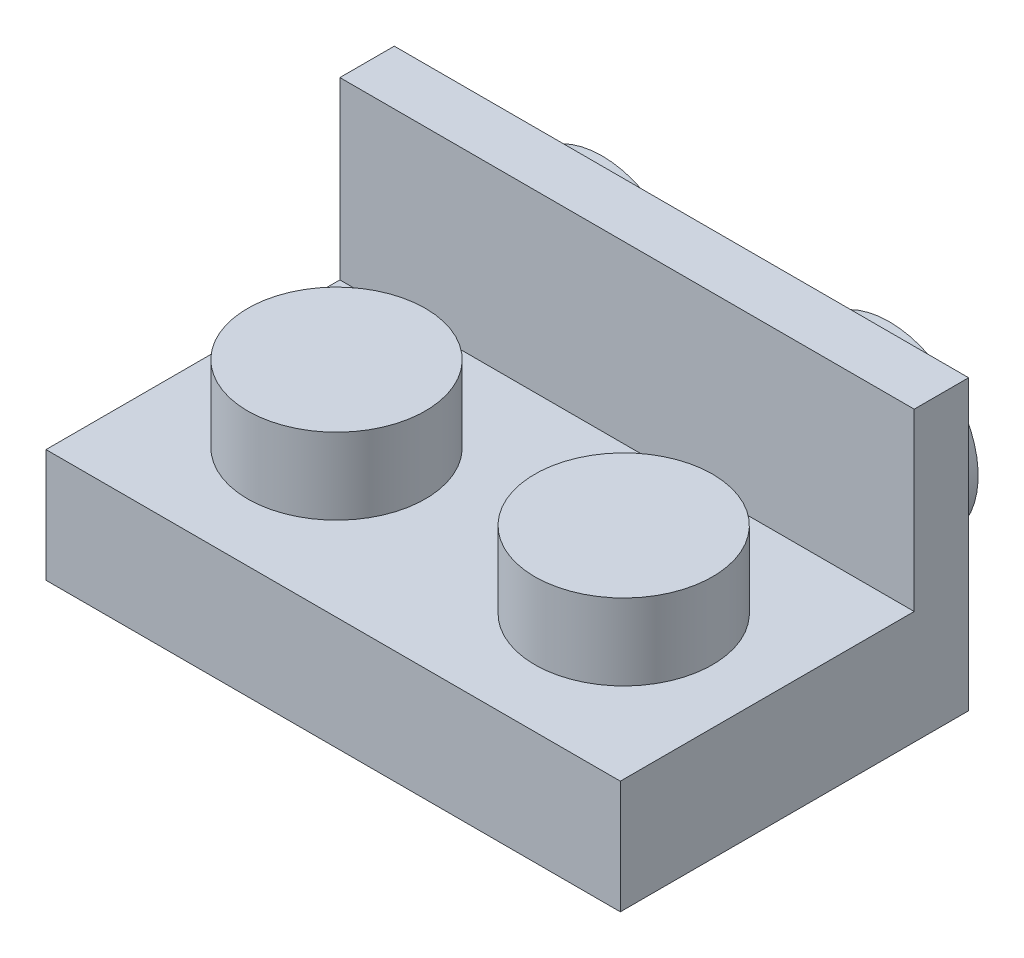
ISO-10303-21;
HEADER;
FILE_DESCRIPTION(('STEP AP214'),'2;1');
FILE_NAME('part.step','',(''),(''),'','','');
FILE_SCHEMA(('AUTOMOTIVE_DESIGN { 1 0 10303 214 1 1 1 1 }'));
ENDSEC;
DATA;
#1=APPLICATION_CONTEXT('core data for automotive mechanical design processes');
#2=APPLICATION_PROTOCOL_DEFINITION('international standard','automotive_design',2000,#1);
#3=PRODUCT_CONTEXT('',#1,'mechanical');
#4=PRODUCT('Part','Part','',(#3));
#5=PRODUCT_RELATED_PRODUCT_CATEGORY('part','',(#4));
#6=PRODUCT_DEFINITION_FORMATION('','',#4);
#7=PRODUCT_DEFINITION_CONTEXT('part definition',#1,'design');
#8=PRODUCT_DEFINITION('design','',#6,#7);
#9=PRODUCT_DEFINITION_SHAPE('','',#8);
#10=(LENGTH_UNIT() NAMED_UNIT(*) SI_UNIT(.MILLI.,.METRE.));
#11=(NAMED_UNIT(*) PLANE_ANGLE_UNIT() SI_UNIT($,.RADIAN.));
#12=(NAMED_UNIT(*) SI_UNIT($,.STERADIAN.) SOLID_ANGLE_UNIT());
#13=UNCERTAINTY_MEASURE_WITH_UNIT(LENGTH_MEASURE(1.E-05),#10,'distance_accuracy_value','');
#14=(GEOMETRIC_REPRESENTATION_CONTEXT(3) GLOBAL_UNCERTAINTY_ASSIGNED_CONTEXT((#13)) GLOBAL_UNIT_ASSIGNED_CONTEXT((#10,
#11,#12)) REPRESENTATION_CONTEXT('',''));
#15=CARTESIAN_POINT('',(0.,0.,0.));
#16=DIRECTION('',(0.,0.,1.));
#17=DIRECTION('',(1.,0.,0.));
#18=AXIS2_PLACEMENT_3D('',#15,#16,#17);
#19=CARTESIAN_POINT('',(-15.83,-3.12,-1.5));
#20=DIRECTION('',(0.,-1.,0.));
#21=DIRECTION('',(0.,0.,-1.));
#22=AXIS2_PLACEMENT_3D('',#19,#20,#21);
#23=PLANE('',#22);
#24=DIRECTION('',(0.,0.,-1.));
#25=VECTOR('',#24,1.);
#26=CARTESIAN_POINT('',(0.,-3.12,-1.5));
#27=LINE('',#26,#25);
#28=CARTESIAN_POINT('',(0.,-3.12,8.1));
#29=VERTEX_POINT('',#28);
#30=CARTESIAN_POINT('',(0.,-3.12,-1.5));
#31=VERTEX_POINT('',#30);
#32=EDGE_CURVE('E142',#29,#31,#27,.T.);
#33=ORIENTED_EDGE('',*,*,#32,.F.);
#34=DIRECTION('',(1.,0.,0.));
#35=VECTOR('',#34,1.);
#36=CARTESIAN_POINT('',(-15.83,-3.12,8.1));
#37=LINE('',#36,#35);
#38=CARTESIAN_POINT('',(-15.83,-3.12,8.1));
#39=VERTEX_POINT('',#38);
#40=EDGE_CURVE('E156',#39,#29,#37,.T.);
#41=ORIENTED_EDGE('',*,*,#40,.F.);
#42=DIRECTION('',(0.,0.,-1.));
#43=VECTOR('',#42,1.);
#44=CARTESIAN_POINT('',(-15.83,-3.12,-1.5));
#45=LINE('',#44,#43);
#46=CARTESIAN_POINT('',(-15.83,-3.12,-1.5));
#47=VERTEX_POINT('',#46);
#48=EDGE_CURVE('E128',#39,#47,#45,.T.);
#49=ORIENTED_EDGE('',*,*,#48,.T.);
#50=DIRECTION('',(1.,0.,0.));
#51=VECTOR('',#50,1.);
#52=CARTESIAN_POINT('',(-15.83,-3.12,-1.5));
#53=LINE('',#52,#51);
#54=EDGE_CURVE('E117',#47,#31,#53,.T.);
#55=ORIENTED_EDGE('',*,*,#54,.T.);
#56=EDGE_LOOP('',(#33,#41,#49,#55));
#57=FACE_BOUND('',#56,.T.);
#58=DIRECTION('',(1.,0.,0.));
#59=VECTOR('',#58,1.);
#60=CARTESIAN_POINT('',(-15.83,-3.12,6.6));
#61=LINE('',#60,#59);
#62=CARTESIAN_POINT('',(-14.33,-3.12,6.6));
#63=VERTEX_POINT('',#62);
#64=CARTESIAN_POINT('',(-1.5,-3.12,6.6));
#65=VERTEX_POINT('',#64);
#66=EDGE_CURVE('E226',#63,#65,#61,.T.);
#67=ORIENTED_EDGE('',*,*,#66,.T.);
#68=DIRECTION('',(0.,0.,-1.));
#69=VECTOR('',#68,1.);
#70=CARTESIAN_POINT('',(-1.5,-3.12,0.));
#71=LINE('',#70,#69);
#72=CARTESIAN_POINT('',(-1.5,-3.12,0.));
#73=VERTEX_POINT('',#72);
#74=EDGE_CURVE('E230',#65,#73,#71,.T.);
#75=ORIENTED_EDGE('',*,*,#74,.T.);
#76=DIRECTION('',(1.,0.,0.));
#77=VECTOR('',#76,1.);
#78=CARTESIAN_POINT('',(-15.83,-3.12,0.));
#79=LINE('',#78,#77);
#80=CARTESIAN_POINT('',(-14.33,-3.12,0.));
#81=VERTEX_POINT('',#80);
#82=EDGE_CURVE('E222',#81,#73,#79,.T.);
#83=ORIENTED_EDGE('',*,*,#82,.F.);
#84=DIRECTION('',(0.,0.,-1.));
#85=VECTOR('',#84,1.);
#86=CARTESIAN_POINT('',(-14.33,-3.12,0.));
#87=LINE('',#86,#85);
#88=EDGE_CURVE('E50',#63,#81,#87,.T.);
#89=ORIENTED_EDGE('',*,*,#88,.F.);
#90=EDGE_LOOP('',(#67,#75,#83,#89));
#91=FACE_BOUND('',#90,.T.);
#92=ADVANCED_FACE('F35',(#57,#91),#23,.T.);
#93=CARTESIAN_POINT('',(-15.83,0.,8.1));
#94=DIRECTION('',(0.,1.,0.));
#95=DIRECTION('',(0.,0.,1.));
#96=AXIS2_PLACEMENT_3D('',#93,#94,#95);
#97=PLANE('',#96);
#98=CARTESIAN_POINT('',(-3.9575,0.,4.05));
#99=DIRECTION('',(0.,1.,0.));
#100=DIRECTION('',(0.,0.,1.));
#101=AXIS2_PLACEMENT_3D('',#98,#99,#100);
#102=CIRCLE('',#101,2.45);
#103=CARTESIAN_POINT('',(-3.9575,0.,6.5));
#104=VERTEX_POINT('',#103);
#105=EDGE_CURVE('E214',#104,#104,#102,.T.);
#106=ORIENTED_EDGE('',*,*,#105,.F.);
#107=EDGE_LOOP('',(#106));
#108=FACE_BOUND('',#107,.T.);
#109=CARTESIAN_POINT('',(-11.8725,0.,4.05));
#110=DIRECTION('',(0.,1.,0.));
#111=DIRECTION('',(0.,0.,1.));
#112=AXIS2_PLACEMENT_3D('',#109,#110,#111);
#113=CIRCLE('',#112,2.45);
#114=CARTESIAN_POINT('',(-11.8725,0.,6.5));
#115=VERTEX_POINT('',#114);
#116=EDGE_CURVE('E208',#115,#115,#113,.T.);
#117=ORIENTED_EDGE('',*,*,#116,.F.);
#118=EDGE_LOOP('',(#117));
#119=FACE_BOUND('',#118,.T.);
#120=DIRECTION('',(0.,0.,1.));
#121=VECTOR('',#120,1.);
#122=CARTESIAN_POINT('',(0.,0.,8.1));
#123=LINE('',#122,#121);
#124=CARTESIAN_POINT('',(0.,0.,0.));
#125=VERTEX_POINT('',#124);
#126=CARTESIAN_POINT('',(0.,0.,8.1));
#127=VERTEX_POINT('',#126);
#128=EDGE_CURVE('E135',#125,#127,#123,.T.);
#129=ORIENTED_EDGE('',*,*,#128,.F.);
#130=DIRECTION('',(1.,0.,0.));
#131=VECTOR('',#130,1.);
#132=CARTESIAN_POINT('',(-15.83,0.,0.));
#133=LINE('',#132,#131);
#134=CARTESIAN_POINT('',(-15.83,0.,0.));
#135=VERTEX_POINT('',#134);
#136=EDGE_CURVE('E59',#135,#125,#133,.T.);
#137=ORIENTED_EDGE('',*,*,#136,.F.);
#138=DIRECTION('',(0.,0.,1.));
#139=VECTOR('',#138,1.);
#140=CARTESIAN_POINT('',(-15.83,0.,8.1));
#141=LINE('',#140,#139);
#142=CARTESIAN_POINT('',(-15.83,0.,8.1));
#143=VERTEX_POINT('',#142);
#144=EDGE_CURVE('E151',#135,#143,#141,.T.);
#145=ORIENTED_EDGE('',*,*,#144,.T.);
#146=DIRECTION('',(1.,0.,0.));
#147=VECTOR('',#146,1.);
#148=CARTESIAN_POINT('',(-15.83,0.,8.1));
#149=LINE('',#148,#147);
#150=EDGE_CURVE('E92',#143,#127,#149,.T.);
#151=ORIENTED_EDGE('',*,*,#150,.T.);
#152=EDGE_LOOP('',(#129,#137,#145,#151));
#153=FACE_BOUND('',#152,.T.);
#154=ADVANCED_FACE('F37',(#108,#119,#153),#97,.T.);
#155=CARTESIAN_POINT('',(-15.83,0.,0.));
#156=DIRECTION('',(0.,0.,1.));
#157=DIRECTION('',(1.,0.,0.));
#158=AXIS2_PLACEMENT_3D('',#155,#156,#157);
#159=PLANE('',#158);
#160=DIRECTION('',(0.,-1.,0.));
#161=VECTOR('',#160,1.);
#162=CARTESIAN_POINT('',(0.,0.,0.));
#163=LINE('',#162,#161);
#164=CARTESIAN_POINT('',(0.,4.83,0.));
#165=VERTEX_POINT('',#164);
#166=EDGE_CURVE('E148',#165,#125,#163,.T.);
#167=ORIENTED_EDGE('',*,*,#166,.F.);
#168=DIRECTION('',(1.,0.,0.));
#169=VECTOR('',#168,1.);
#170=CARTESIAN_POINT('',(-15.83,4.83,0.));
#171=LINE('',#170,#169);
#172=CARTESIAN_POINT('',(-15.83,4.83,0.));
#173=VERTEX_POINT('',#172);
#174=EDGE_CURVE('E116',#173,#165,#171,.T.);
#175=ORIENTED_EDGE('',*,*,#174,.F.);
#176=DIRECTION('',(0.,-1.,0.));
#177=VECTOR('',#176,1.);
#178=CARTESIAN_POINT('',(-15.83,0.,0.));
#179=LINE('',#178,#177);
#180=EDGE_CURVE('E125',#173,#135,#179,.T.);
#181=ORIENTED_EDGE('',*,*,#180,.T.);
#182=ORIENTED_EDGE('',*,*,#136,.T.);
#183=EDGE_LOOP('',(#167,#175,#181,#182));
#184=FACE_BOUND('',#183,.T.);
#185=ADVANCED_FACE('F195',(#184),#159,.T.);
#186=CARTESIAN_POINT('',(-15.83,4.83,0.));
#187=DIRECTION('',(0.,1.,0.));
#188=DIRECTION('',(0.,0.,1.));
#189=AXIS2_PLACEMENT_3D('',#186,#187,#188);
#190=PLANE('',#189);
#191=DIRECTION('',(0.,0.,1.));
#192=VECTOR('',#191,1.);
#193=CARTESIAN_POINT('',(0.,4.83,0.));
#194=LINE('',#193,#192);
#195=CARTESIAN_POINT('',(0.,4.83,-1.5));
#196=VERTEX_POINT('',#195);
#197=EDGE_CURVE('E111',#196,#165,#194,.T.);
#198=ORIENTED_EDGE('',*,*,#197,.F.);
#199=DIRECTION('',(1.,0.,0.));
#200=VECTOR('',#199,1.);
#201=CARTESIAN_POINT('',(-15.83,4.83,-1.5));
#202=LINE('',#201,#200);
#203=CARTESIAN_POINT('',(-15.83,4.83,-1.5));
#204=VERTEX_POINT('',#203);
#205=EDGE_CURVE('E105',#204,#196,#202,.T.);
#206=ORIENTED_EDGE('',*,*,#205,.F.);
#207=DIRECTION('',(0.,0.,1.));
#208=VECTOR('',#207,1.);
#209=CARTESIAN_POINT('',(-15.83,4.83,0.));
#210=LINE('',#209,#208);
#211=EDGE_CURVE('E108',#204,#173,#210,.T.);
#212=ORIENTED_EDGE('',*,*,#211,.T.);
#213=ORIENTED_EDGE('',*,*,#174,.T.);
#214=EDGE_LOOP('',(#198,#206,#212,#213));
#215=FACE_BOUND('',#214,.T.);
#216=ADVANCED_FACE('F107',(#215),#190,.T.);
#217=CARTESIAN_POINT('',(-15.83,4.83,-1.5));
#218=DIRECTION('',(0.,0.,-1.));
#219=DIRECTION('',(0.,1.,0.));
#220=AXIS2_PLACEMENT_3D('',#217,#218,#219);
#221=PLANE('',#220);
#222=CARTESIAN_POINT('',(-11.8725,0.855,-1.5));
#223=DIRECTION('',(0.,0.,-1.));
#224=DIRECTION('',(0.,1.,0.));
#225=AXIS2_PLACEMENT_3D('',#222,#223,#224);
#226=CIRCLE('',#225,2.45);
#227=CARTESIAN_POINT('',(-11.8725,3.305,-1.5));
#228=VERTEX_POINT('',#227);
#229=EDGE_CURVE('E273',#228,#228,#226,.T.);
#230=ORIENTED_EDGE('',*,*,#229,.F.);
#231=EDGE_LOOP('',(#230));
#232=FACE_BOUND('',#231,.T.);
#233=CARTESIAN_POINT('',(-3.9575,0.855,-1.5));
#234=DIRECTION('',(0.,0.,-1.));
#235=DIRECTION('',(0.,1.,0.));
#236=AXIS2_PLACEMENT_3D('',#233,#234,#235);
#237=CIRCLE('',#236,2.45);
#238=CARTESIAN_POINT('',(-3.9575,3.305,-1.5));
#239=VERTEX_POINT('',#238);
#240=EDGE_CURVE('E264',#239,#239,#237,.T.);
#241=ORIENTED_EDGE('',*,*,#240,.F.);
#242=EDGE_LOOP('',(#241));
#243=FACE_BOUND('',#242,.T.);
#244=DIRECTION('',(0.,1.,0.));
#245=VECTOR('',#244,1.);
#246=CARTESIAN_POINT('',(0.,4.83,-1.5));
#247=LINE('',#246,#245);
#248=EDGE_CURVE('E145',#31,#196,#247,.T.);
#249=ORIENTED_EDGE('',*,*,#248,.F.);
#250=ORIENTED_EDGE('',*,*,#54,.F.);
#251=DIRECTION('',(0.,1.,0.));
#252=VECTOR('',#251,1.);
#253=CARTESIAN_POINT('',(-15.83,4.83,-1.5));
#254=LINE('',#253,#252);
#255=EDGE_CURVE('E123',#47,#204,#254,.T.);
#256=ORIENTED_EDGE('',*,*,#255,.T.);
#257=ORIENTED_EDGE('',*,*,#205,.T.);
#258=EDGE_LOOP('',(#249,#250,#256,#257));
#259=FACE_BOUND('',#258,.T.);
#260=ADVANCED_FACE('F127',(#232,#243,#259),#221,.T.);
#261=CARTESIAN_POINT('',(-15.83,-3.12,8.1));
#262=DIRECTION('',(0.,0.,1.));
#263=DIRECTION('',(1.,0.,0.));
#264=AXIS2_PLACEMENT_3D('',#261,#262,#263);
#265=PLANE('',#264);
#266=DIRECTION('',(0.,-1.,0.));
#267=VECTOR('',#266,1.);
#268=CARTESIAN_POINT('',(0.,-3.12,8.1));
#269=LINE('',#268,#267);
#270=EDGE_CURVE('E138',#127,#29,#269,.T.);
#271=ORIENTED_EDGE('',*,*,#270,.F.);
#272=ORIENTED_EDGE('',*,*,#150,.F.);
#273=DIRECTION('',(0.,-1.,0.));
#274=VECTOR('',#273,1.);
#275=CARTESIAN_POINT('',(-15.83,-3.12,8.1));
#276=LINE('',#275,#274);
#277=EDGE_CURVE('E130',#143,#39,#276,.T.);
#278=ORIENTED_EDGE('',*,*,#277,.T.);
#279=ORIENTED_EDGE('',*,*,#40,.T.);
#280=EDGE_LOOP('',(#271,#272,#278,#279));
#281=FACE_BOUND('',#280,.T.);
#282=ADVANCED_FACE('F188',(#281),#265,.T.);
#283=CARTESIAN_POINT('',(-15.83,0.,0.));
#284=DIRECTION('',(1.,0.,0.));
#285=DIRECTION('',(0.,0.,-1.));
#286=AXIS2_PLACEMENT_3D('',#283,#284,#285);
#287=PLANE('',#286);
#288=ORIENTED_EDGE('',*,*,#144,.F.);
#289=ORIENTED_EDGE('',*,*,#180,.F.);
#290=ORIENTED_EDGE('',*,*,#211,.F.);
#291=ORIENTED_EDGE('',*,*,#255,.F.);
#292=ORIENTED_EDGE('',*,*,#48,.F.);
#293=ORIENTED_EDGE('',*,*,#277,.F.);
#294=EDGE_LOOP('',(#288,#289,#290,#291,#292,#293));
#295=FACE_BOUND('',#294,.T.);
#296=ADVANCED_FACE('F121',(#295),#287,.F.);
#297=CARTESIAN_POINT('',(0.,0.,0.));
#298=DIRECTION('',(1.,0.,0.));
#299=DIRECTION('',(0.,0.,-1.));
#300=AXIS2_PLACEMENT_3D('',#297,#298,#299);
#301=PLANE('',#300);
#302=ORIENTED_EDGE('',*,*,#128,.T.);
#303=ORIENTED_EDGE('',*,*,#270,.T.);
#304=ORIENTED_EDGE('',*,*,#32,.T.);
#305=ORIENTED_EDGE('',*,*,#248,.T.);
#306=ORIENTED_EDGE('',*,*,#197,.T.);
#307=ORIENTED_EDGE('',*,*,#166,.T.);
#308=EDGE_LOOP('',(#302,#303,#304,#305,#306,#307));
#309=FACE_BOUND('',#308,.T.);
#310=ADVANCED_FACE('F203',(#309),#301,.T.);
#311=CARTESIAN_POINT('',(-11.8725,2.1,4.05));
#312=DIRECTION('',(0.,-1.,0.));
#313=DIRECTION('',(0.,0.,-1.));
#314=AXIS2_PLACEMENT_3D('',#311,#312,#313);
#315=CYLINDRICAL_SURFACE('',#314,2.45);
#316=CARTESIAN_POINT('',(-11.8725,2.1,4.05));
#317=DIRECTION('',(0.,1.,0.));
#318=DIRECTION('',(0.,0.,1.));
#319=AXIS2_PLACEMENT_3D('',#316,#317,#318);
#320=CIRCLE('',#319,2.45);
#321=CARTESIAN_POINT('',(-11.8725,2.1,6.5));
#322=VERTEX_POINT('',#321);
#323=EDGE_CURVE('E139',#322,#322,#320,.T.);
#324=ORIENTED_EDGE('',*,*,#323,.F.);
#325=EDGE_LOOP('',(#324));
#326=FACE_BOUND('',#325,.T.);
#327=ORIENTED_EDGE('',*,*,#116,.T.);
#328=EDGE_LOOP('',(#327));
#329=FACE_BOUND('',#328,.T.);
#330=ADVANCED_FACE('F369',(#326,#329),#315,.T.);
#331=CARTESIAN_POINT('',(-11.8725,2.1,4.05));
#332=DIRECTION('',(0.,1.,0.));
#333=DIRECTION('',(0.,0.,1.));
#334=AXIS2_PLACEMENT_3D('',#331,#332,#333);
#335=PLANE('',#334);
#336=ORIENTED_EDGE('',*,*,#323,.T.);
#337=EDGE_LOOP('',(#336));
#338=FACE_BOUND('',#337,.T.);
#339=ADVANCED_FACE('F365',(#338),#335,.T.);
#340=CARTESIAN_POINT('',(-3.9575,2.1,4.05));
#341=DIRECTION('',(0.,-1.,0.));
#342=DIRECTION('',(0.,0.,-1.));
#343=AXIS2_PLACEMENT_3D('',#340,#341,#342);
#344=CYLINDRICAL_SURFACE('',#343,2.45);
#345=CARTESIAN_POINT('',(-3.9575,2.1,4.05));
#346=DIRECTION('',(0.,1.,0.));
#347=DIRECTION('',(0.,0.,1.));
#348=AXIS2_PLACEMENT_3D('',#345,#346,#347);
#349=CIRCLE('',#348,2.45);
#350=CARTESIAN_POINT('',(-3.9575,2.1,6.5));
#351=VERTEX_POINT('',#350);
#352=EDGE_CURVE('E211',#351,#351,#349,.T.);
#353=ORIENTED_EDGE('',*,*,#352,.F.);
#354=EDGE_LOOP('',(#353));
#355=FACE_BOUND('',#354,.T.);
#356=ORIENTED_EDGE('',*,*,#105,.T.);
#357=EDGE_LOOP('',(#356));
#358=FACE_BOUND('',#357,.T.);
#359=ADVANCED_FACE('F361',(#355,#358),#344,.T.);
#360=CARTESIAN_POINT('',(-3.9575,2.1,4.05));
#361=DIRECTION('',(0.,1.,0.));
#362=DIRECTION('',(0.,0.,1.));
#363=AXIS2_PLACEMENT_3D('',#360,#361,#362);
#364=PLANE('',#363);
#365=ORIENTED_EDGE('',*,*,#352,.T.);
#366=EDGE_LOOP('',(#365));
#367=FACE_BOUND('',#366,.T.);
#368=ADVANCED_FACE('F328',(#367),#364,.T.);
#369=CARTESIAN_POINT('',(-15.83,-1.5,8.1));
#370=DIRECTION('',(0.,1.,0.));
#371=DIRECTION('',(0.,0.,1.));
#372=AXIS2_PLACEMENT_3D('',#369,#370,#371);
#373=PLANE('',#372);
#374=CARTESIAN_POINT('',(-7.915,-1.5,3.3));
#375=DIRECTION('',(0.,1.,0.));
#376=DIRECTION('',(0.,0.,1.));
#377=AXIS2_PLACEMENT_3D('',#374,#375,#376);
#378=CIRCLE('',#377,1.5);
#379=CARTESIAN_POINT('',(-7.915,-1.5,4.8));
#380=VERTEX_POINT('',#379);
#381=EDGE_CURVE('E12',#380,#380,#378,.F.);
#382=ORIENTED_EDGE('',*,*,#381,.F.);
#383=EDGE_LOOP('',(#382));
#384=FACE_BOUND('',#383,.T.);
#385=CARTESIAN_POINT('',(-3.9575,-1.5,4.05));
#386=DIRECTION('',(0.,1.,0.));
#387=DIRECTION('',(0.,0.,1.));
#388=AXIS2_PLACEMENT_3D('',#385,#386,#387);
#389=CIRCLE('',#388,0.950000000000001);
#390=CARTESIAN_POINT('',(-3.9575,-1.5,5.));
#391=VERTEX_POINT('',#390);
#392=EDGE_CURVE('E241',#391,#391,#389,.T.);
#393=ORIENTED_EDGE('',*,*,#392,.T.);
#394=EDGE_LOOP('',(#393));
#395=FACE_BOUND('',#394,.T.);
#396=CARTESIAN_POINT('',(-11.8725,-1.5,4.05));
#397=DIRECTION('',(0.,1.,0.));
#398=DIRECTION('',(0.,0.,1.));
#399=AXIS2_PLACEMENT_3D('',#396,#397,#398);
#400=CIRCLE('',#399,0.950000000000001);
#401=CARTESIAN_POINT('',(-11.8725,-1.5,5.));
#402=VERTEX_POINT('',#401);
#403=EDGE_CURVE('E240',#402,#402,#400,.T.);
#404=ORIENTED_EDGE('',*,*,#403,.T.);
#405=EDGE_LOOP('',(#404));
#406=FACE_BOUND('',#405,.T.);
#407=DIRECTION('',(0.,0.,1.));
#408=VECTOR('',#407,1.);
#409=CARTESIAN_POINT('',(-1.5,-1.5,0.));
#410=LINE('',#409,#408);
#411=CARTESIAN_POINT('',(-1.5,-1.5,0.));
#412=VERTEX_POINT('',#411);
#413=CARTESIAN_POINT('',(-1.5,-1.5,6.6));
#414=VERTEX_POINT('',#413);
#415=EDGE_CURVE('E245',#412,#414,#410,.T.);
#416=ORIENTED_EDGE('',*,*,#415,.T.);
#417=DIRECTION('',(1.,0.,0.));
#418=VECTOR('',#417,1.);
#419=CARTESIAN_POINT('',(-15.83,-1.5,6.6));
#420=LINE('',#419,#418);
#421=CARTESIAN_POINT('',(-14.33,-1.5,6.6));
#422=VERTEX_POINT('',#421);
#423=EDGE_CURVE('E229',#422,#414,#420,.T.);
#424=ORIENTED_EDGE('',*,*,#423,.F.);
#425=DIRECTION('',(0.,0.,1.));
#426=VECTOR('',#425,1.);
#427=CARTESIAN_POINT('',(-14.33,-1.5,0.));
#428=LINE('',#427,#426);
#429=CARTESIAN_POINT('',(-14.33,-1.5,0.));
#430=VERTEX_POINT('',#429);
#431=EDGE_CURVE('E249',#430,#422,#428,.T.);
#432=ORIENTED_EDGE('',*,*,#431,.F.);
#433=DIRECTION('',(-1.,0.,0.));
#434=VECTOR('',#433,1.);
#435=CARTESIAN_POINT('',(-15.83,-1.5,0.));
#436=LINE('',#435,#434);
#437=EDGE_CURVE('E217',#412,#430,#436,.T.);
#438=ORIENTED_EDGE('',*,*,#437,.F.);
#439=EDGE_LOOP('',(#416,#424,#432,#438));
#440=FACE_BOUND('',#439,.T.);
#441=ADVANCED_FACE('F303',(#384,#395,#406,#440),#373,.F.);
#442=CARTESIAN_POINT('',(-15.83,4.83,0.));
#443=DIRECTION('',(0.,0.,-1.));
#444=DIRECTION('',(0.,1.,0.));
#445=AXIS2_PLACEMENT_3D('',#442,#443,#444);
#446=PLANE('',#445);
#447=ORIENTED_EDGE('',*,*,#437,.T.);
#448=DIRECTION('',(0.,1.,0.));
#449=VECTOR('',#448,1.);
#450=CARTESIAN_POINT('',(-14.33,0.,0.));
#451=LINE('',#450,#449);
#452=EDGE_CURVE('E224',#81,#430,#451,.T.);
#453=ORIENTED_EDGE('',*,*,#452,.F.);
#454=ORIENTED_EDGE('',*,*,#82,.T.);
#455=DIRECTION('',(0.,1.,0.));
#456=VECTOR('',#455,1.);
#457=CARTESIAN_POINT('',(-1.5,0.,0.));
#458=LINE('',#457,#456);
#459=EDGE_CURVE('E233',#73,#412,#458,.T.);
#460=ORIENTED_EDGE('',*,*,#459,.T.);
#461=EDGE_LOOP('',(#447,#453,#454,#460));
#462=FACE_BOUND('',#461,.T.);
#463=ADVANCED_FACE('F327',(#462),#446,.F.);
#464=CARTESIAN_POINT('',(-15.83,-3.12,6.6));
#465=DIRECTION('',(0.,0.,1.));
#466=DIRECTION('',(1.,0.,0.));
#467=AXIS2_PLACEMENT_3D('',#464,#465,#466);
#468=PLANE('',#467);
#469=DIRECTION('',(0.,-1.,0.));
#470=VECTOR('',#469,1.);
#471=CARTESIAN_POINT('',(-1.5,0.,6.6));
#472=LINE('',#471,#470);
#473=EDGE_CURVE('E234',#414,#65,#472,.T.);
#474=ORIENTED_EDGE('',*,*,#473,.T.);
#475=ORIENTED_EDGE('',*,*,#66,.F.);
#476=DIRECTION('',(0.,-1.,0.));
#477=VECTOR('',#476,1.);
#478=CARTESIAN_POINT('',(-14.33,0.,6.6));
#479=LINE('',#478,#477);
#480=EDGE_CURVE('E225',#422,#63,#479,.T.);
#481=ORIENTED_EDGE('',*,*,#480,.F.);
#482=ORIENTED_EDGE('',*,*,#423,.T.);
#483=EDGE_LOOP('',(#474,#475,#481,#482));
#484=FACE_BOUND('',#483,.T.);
#485=ADVANCED_FACE('F332',(#484),#468,.F.);
#486=CARTESIAN_POINT('',(-14.33,0.,0.));
#487=DIRECTION('',(1.,0.,0.));
#488=DIRECTION('',(0.,0.,-1.));
#489=AXIS2_PLACEMENT_3D('',#486,#487,#488);
#490=PLANE('',#489);
#491=ORIENTED_EDGE('',*,*,#431,.T.);
#492=ORIENTED_EDGE('',*,*,#480,.T.);
#493=ORIENTED_EDGE('',*,*,#88,.T.);
#494=ORIENTED_EDGE('',*,*,#452,.T.);
#495=EDGE_LOOP('',(#491,#492,#493,#494));
#496=FACE_BOUND('',#495,.T.);
#497=ADVANCED_FACE('F336',(#496),#490,.T.);
#498=CARTESIAN_POINT('',(-1.5,0.,0.));
#499=DIRECTION('',(1.,0.,0.));
#500=DIRECTION('',(0.,0.,-1.));
#501=AXIS2_PLACEMENT_3D('',#498,#499,#500);
#502=PLANE('',#501);
#503=ORIENTED_EDGE('',*,*,#459,.F.);
#504=ORIENTED_EDGE('',*,*,#74,.F.);
#505=ORIENTED_EDGE('',*,*,#473,.F.);
#506=ORIENTED_EDGE('',*,*,#415,.F.);
#507=EDGE_LOOP('',(#503,#504,#505,#506));
#508=FACE_BOUND('',#507,.T.);
#509=ADVANCED_FACE('F340',(#508),#502,.F.);
#510=CARTESIAN_POINT('',(-11.8725,2.1,4.05));
#511=DIRECTION('',(0.,-1.,0.));
#512=DIRECTION('',(0.,0.,-1.));
#513=AXIS2_PLACEMENT_3D('',#510,#511,#512);
#514=CYLINDRICAL_SURFACE('',#513,0.950000000000001);
#515=CARTESIAN_POINT('',(-11.8725,0.6,4.05));
#516=DIRECTION('',(0.,1.,0.));
#517=DIRECTION('',(0.,0.,1.));
#518=AXIS2_PLACEMENT_3D('',#515,#516,#517);
#519=CIRCLE('',#518,0.950000000000001);
#520=CARTESIAN_POINT('',(-11.8725,0.6,5.));
#521=VERTEX_POINT('',#520);
#522=EDGE_CURVE('E242',#521,#521,#519,.T.);
#523=ORIENTED_EDGE('',*,*,#522,.T.);
#524=EDGE_LOOP('',(#523));
#525=FACE_BOUND('',#524,.T.);
#526=ORIENTED_EDGE('',*,*,#403,.F.);
#527=EDGE_LOOP('',(#526));
#528=FACE_BOUND('',#527,.T.);
#529=ADVANCED_FACE('F343',(#525,#528),#514,.F.);
#530=CARTESIAN_POINT('',(-11.8725,0.6,4.05));
#531=DIRECTION('',(0.,1.,0.));
#532=DIRECTION('',(0.,0.,1.));
#533=AXIS2_PLACEMENT_3D('',#530,#531,#532);
#534=PLANE('',#533);
#535=ORIENTED_EDGE('',*,*,#522,.F.);
#536=EDGE_LOOP('',(#535));
#537=FACE_BOUND('',#536,.T.);
#538=ADVANCED_FACE('F347',(#537),#534,.F.);
#539=CARTESIAN_POINT('',(-3.9575,2.1,4.05));
#540=DIRECTION('',(0.,-1.,0.));
#541=DIRECTION('',(0.,0.,-1.));
#542=AXIS2_PLACEMENT_3D('',#539,#540,#541);
#543=CYLINDRICAL_SURFACE('',#542,0.950000000000001);
#544=CARTESIAN_POINT('',(-3.9575,0.6,4.05));
#545=DIRECTION('',(0.,1.,0.));
#546=DIRECTION('',(0.,0.,1.));
#547=AXIS2_PLACEMENT_3D('',#544,#545,#546);
#548=CIRCLE('',#547,0.950000000000001);
#549=CARTESIAN_POINT('',(-3.9575,0.6,5.));
#550=VERTEX_POINT('',#549);
#551=EDGE_CURVE('E237',#550,#550,#548,.T.);
#552=ORIENTED_EDGE('',*,*,#551,.T.);
#553=EDGE_LOOP('',(#552));
#554=FACE_BOUND('',#553,.T.);
#555=ORIENTED_EDGE('',*,*,#392,.F.);
#556=EDGE_LOOP('',(#555));
#557=FACE_BOUND('',#556,.T.);
#558=ADVANCED_FACE('F351',(#554,#557),#543,.F.);
#559=CARTESIAN_POINT('',(-3.9575,0.6,4.05));
#560=DIRECTION('',(0.,1.,0.));
#561=DIRECTION('',(0.,0.,1.));
#562=AXIS2_PLACEMENT_3D('',#559,#560,#561);
#563=PLANE('',#562);
#564=ORIENTED_EDGE('',*,*,#551,.F.);
#565=EDGE_LOOP('',(#564));
#566=FACE_BOUND('',#565,.T.);
#567=ADVANCED_FACE('F321',(#566),#563,.F.);
#568=CARTESIAN_POINT('',(-3.9575,0.855,-3.27));
#569=DIRECTION('',(0.,0.,-1.));
#570=DIRECTION('',(0.,1.,0.));
#571=AXIS2_PLACEMENT_3D('',#568,#569,#570);
#572=PLANE('',#571);
#573=CARTESIAN_POINT('',(-3.9575,0.855,-3.27));
#574=DIRECTION('',(0.,0.,-1.));
#575=DIRECTION('',(0.,1.,0.));
#576=AXIS2_PLACEMENT_3D('',#573,#574,#575);
#577=CIRCLE('',#576,2.45);
#578=CARTESIAN_POINT('',(-3.9575,3.305,-3.27));
#579=VERTEX_POINT('',#578);
#580=EDGE_CURVE('E263',#579,#579,#577,.T.);
#581=ORIENTED_EDGE('',*,*,#580,.T.);
#582=EDGE_LOOP('',(#581));
#583=FACE_BOUND('',#582,.T.);
#584=CARTESIAN_POINT('',(-3.9575,0.855,-3.27));
#585=DIRECTION('',(0.,0.,-1.));
#586=DIRECTION('',(0.,1.,0.));
#587=AXIS2_PLACEMENT_3D('',#584,#585,#586);
#588=CIRCLE('',#587,1.47);
#589=CARTESIAN_POINT('',(-3.9575,2.325,-3.27));
#590=VERTEX_POINT('',#589);
#591=EDGE_CURVE('E267',#590,#590,#588,.T.);
#592=ORIENTED_EDGE('',*,*,#591,.F.);
#593=EDGE_LOOP('',(#592));
#594=FACE_BOUND('',#593,.T.);
#595=ADVANCED_FACE('F318',(#583,#594),#572,.T.);
#596=CARTESIAN_POINT('',(-3.9575,0.855,-3.27));
#597=DIRECTION('',(0.,0.,1.));
#598=DIRECTION('',(0.,-1.,0.));
#599=AXIS2_PLACEMENT_3D('',#596,#597,#598);
#600=CYLINDRICAL_SURFACE('',#599,2.45);
#601=ORIENTED_EDGE('',*,*,#580,.F.);
#602=EDGE_LOOP('',(#601));
#603=FACE_BOUND('',#602,.T.);
#604=ORIENTED_EDGE('',*,*,#240,.T.);
#605=EDGE_LOOP('',(#604));
#606=FACE_BOUND('',#605,.T.);
#607=ADVANCED_FACE('F316',(#603,#606),#600,.T.);
#608=CARTESIAN_POINT('',(-3.9575,0.855,-3.27));
#609=DIRECTION('',(0.,0.,1.));
#610=DIRECTION('',(0.,-1.,0.));
#611=AXIS2_PLACEMENT_3D('',#608,#609,#610);
#612=CYLINDRICAL_SURFACE('',#611,1.47);
#613=ORIENTED_EDGE('',*,*,#591,.T.);
#614=EDGE_LOOP('',(#613));
#615=FACE_BOUND('',#614,.T.);
#616=CARTESIAN_POINT('',(-3.9575,0.855,-1.5));
#617=DIRECTION('',(0.,0.,-1.));
#618=DIRECTION('',(0.,1.,0.));
#619=AXIS2_PLACEMENT_3D('',#616,#617,#618);
#620=CIRCLE('',#619,1.47);
#621=CARTESIAN_POINT('',(-3.9575,2.325,-1.5));
#622=VERTEX_POINT('',#621);
#623=EDGE_CURVE('E153',#622,#622,#620,.F.);
#624=ORIENTED_EDGE('',*,*,#623,.T.);
#625=EDGE_LOOP('',(#624));
#626=FACE_BOUND('',#625,.T.);
#627=ADVANCED_FACE('F185',(#615,#626),#612,.F.);
#628=ORIENTED_EDGE('',*,*,#623,.F.);
#629=EDGE_LOOP('',(#628));
#630=FACE_BOUND('',#629,.T.);
#631=ADVANCED_FACE('F169',(#630),#221,.T.);
#632=CARTESIAN_POINT('',(-11.8725,0.855,-3.27));
#633=DIRECTION('',(0.,0.,-1.));
#634=DIRECTION('',(0.,1.,0.));
#635=AXIS2_PLACEMENT_3D('',#632,#633,#634);
#636=PLANE('',#635);
#637=CARTESIAN_POINT('',(-11.8725,0.855,-3.27));
#638=DIRECTION('',(0.,0.,-1.));
#639=DIRECTION('',(0.,1.,0.));
#640=AXIS2_PLACEMENT_3D('',#637,#638,#639);
#641=CIRCLE('',#640,2.45);
#642=CARTESIAN_POINT('',(-11.8725,3.305,-3.27));
#643=VERTEX_POINT('',#642);
#644=EDGE_CURVE('E272',#643,#643,#641,.T.);
#645=ORIENTED_EDGE('',*,*,#644,.T.);
#646=EDGE_LOOP('',(#645));
#647=FACE_BOUND('',#646,.T.);
#648=CARTESIAN_POINT('',(-11.8725,0.855,-3.27));
#649=DIRECTION('',(0.,0.,-1.));
#650=DIRECTION('',(0.,1.,0.));
#651=AXIS2_PLACEMENT_3D('',#648,#649,#650);
#652=CIRCLE('',#651,1.51);
#653=CARTESIAN_POINT('',(-11.8725,2.365,-3.27));
#654=VERTEX_POINT('',#653);
#655=EDGE_CURVE('E276',#654,#654,#652,.T.);
#656=ORIENTED_EDGE('',*,*,#655,.F.);
#657=EDGE_LOOP('',(#656));
#658=FACE_BOUND('',#657,.T.);
#659=ADVANCED_FACE('F184',(#647,#658),#636,.T.);
#660=CARTESIAN_POINT('',(-11.8725,0.855,-3.27));
#661=DIRECTION('',(0.,0.,1.));
#662=DIRECTION('',(0.,-1.,0.));
#663=AXIS2_PLACEMENT_3D('',#660,#661,#662);
#664=CYLINDRICAL_SURFACE('',#663,2.45);
#665=ORIENTED_EDGE('',*,*,#644,.F.);
#666=EDGE_LOOP('',(#665));
#667=FACE_BOUND('',#666,.T.);
#668=ORIENTED_EDGE('',*,*,#229,.T.);
#669=EDGE_LOOP('',(#668));
#670=FACE_BOUND('',#669,.T.);
#671=ADVANCED_FACE('F178',(#667,#670),#664,.T.);
#672=CARTESIAN_POINT('',(-11.8725,0.855,-3.27));
#673=DIRECTION('',(0.,0.,1.));
#674=DIRECTION('',(0.,-1.,0.));
#675=AXIS2_PLACEMENT_3D('',#672,#673,#674);
#676=CYLINDRICAL_SURFACE('',#675,1.51);
#677=ORIENTED_EDGE('',*,*,#655,.T.);
#678=EDGE_LOOP('',(#677));
#679=FACE_BOUND('',#678,.T.);
#680=CARTESIAN_POINT('',(-11.8725,0.855,-1.5));
#681=DIRECTION('',(0.,0.,-1.));
#682=DIRECTION('',(0.,1.,0.));
#683=AXIS2_PLACEMENT_3D('',#680,#681,#682);
#684=CIRCLE('',#683,1.51);
#685=CARTESIAN_POINT('',(-11.8725,2.365,-1.5));
#686=VERTEX_POINT('',#685);
#687=EDGE_CURVE('E43',#686,#686,#684,.F.);
#688=ORIENTED_EDGE('',*,*,#687,.T.);
#689=EDGE_LOOP('',(#688));
#690=FACE_BOUND('',#689,.T.);
#691=ADVANCED_FACE('F163',(#679,#690),#676,.F.);
#692=ORIENTED_EDGE('',*,*,#687,.F.);
#693=EDGE_LOOP('',(#692));
#694=FACE_BOUND('',#693,.T.);
#695=ADVANCED_FACE('F165',(#694),#221,.T.);
#696=CARTESIAN_POINT('',(-7.915,-7.36264068711928,3.3));
#697=DIRECTION('',(0.,1.,0.));
#698=DIRECTION('',(0.,0.,1.));
#699=AXIS2_PLACEMENT_3D('',#696,#697,#698);
#700=CYLINDRICAL_SURFACE('',#699,1.5);
#701=ORIENTED_EDGE('',*,*,#381,.T.);
#702=EDGE_LOOP('',(#701));
#703=FACE_BOUND('',#702,.T.);
#704=CARTESIAN_POINT('',(-7.915,-2.92,3.3));
#705=DIRECTION('',(0.,-1.,0.));
#706=DIRECTION('',(0.,0.,-1.));
#707=AXIS2_PLACEMENT_3D('',#704,#705,#706);
#708=CIRCLE('',#707,1.5);
#709=CARTESIAN_POINT('',(-7.915,-2.92,1.8));
#710=VERTEX_POINT('',#709);
#711=EDGE_CURVE('E281',#710,#710,#708,.T.);
#712=ORIENTED_EDGE('',*,*,#711,.F.);
#713=EDGE_LOOP('',(#712));
#714=FACE_BOUND('',#713,.T.);
#715=ADVANCED_FACE('F167',(#703,#714),#700,.T.);
#716=CARTESIAN_POINT('',(-7.915,-7.36264068711928,3.3));
#717=DIRECTION('',(0.,1.,0.));
#718=DIRECTION('',(0.,0.,1.));
#719=AXIS2_PLACEMENT_3D('',#716,#717,#718);
#720=CYLINDRICAL_SURFACE('',#719,0.66);
#721=CARTESIAN_POINT('',(-7.915,-1.5,3.3));
#722=DIRECTION('',(0.,-1.,0.));
#723=DIRECTION('',(0.,0.,-1.));
#724=AXIS2_PLACEMENT_3D('',#721,#722,#723);
#725=CIRCLE('',#724,0.66);
#726=CARTESIAN_POINT('',(-7.915,-1.5,2.64));
#727=VERTEX_POINT('',#726);
#728=EDGE_CURVE('E285',#727,#727,#725,.T.);
#729=ORIENTED_EDGE('',*,*,#728,.F.);
#730=EDGE_LOOP('',(#729));
#731=FACE_BOUND('',#730,.T.);
#732=CARTESIAN_POINT('',(-7.915,-2.92,3.3));
#733=DIRECTION('',(0.,-1.,0.));
#734=DIRECTION('',(0.,0.,-1.));
#735=AXIS2_PLACEMENT_3D('',#732,#733,#734);
#736=CIRCLE('',#735,0.66);
#737=CARTESIAN_POINT('',(-7.915,-2.92,2.64));
#738=VERTEX_POINT('',#737);
#739=EDGE_CURVE('E282',#738,#738,#736,.T.);
#740=ORIENTED_EDGE('',*,*,#739,.T.);
#741=EDGE_LOOP('',(#740));
#742=FACE_BOUND('',#741,.T.);
#743=ADVANCED_FACE('F175',(#731,#742),#720,.F.);
#744=CARTESIAN_POINT('',(-15.83,-2.92,-1.5));
#745=DIRECTION('',(0.,-1.,0.));
#746=DIRECTION('',(0.,0.,-1.));
#747=AXIS2_PLACEMENT_3D('',#744,#745,#746);
#748=PLANE('',#747);
#749=ORIENTED_EDGE('',*,*,#739,.F.);
#750=EDGE_LOOP('',(#749));
#751=FACE_BOUND('',#750,.T.);
#752=ORIENTED_EDGE('',*,*,#711,.T.);
#753=EDGE_LOOP('',(#752));
#754=FACE_BOUND('',#753,.T.);
#755=ADVANCED_FACE('F291',(#751,#754),#748,.T.);
#756=ORIENTED_EDGE('',*,*,#728,.T.);
#757=EDGE_LOOP('',(#756));
#758=FACE_BOUND('',#757,.T.);
#759=ADVANCED_FACE('F294',(#758),#373,.F.);
#760=CLOSED_SHELL('',(#92,#154,#185,#216,#260,#282,#296,#310,#330,#339,#359,#368,#441,#463,#485,
#497,#509,#529,#538,#558,#567,#595,#607,#627,#631,#659,#671,#691,#695,#715,#743,#755,#759));
#761=MANIFOLD_SOLID_BREP('B2',#760);
#762=ADVANCED_BREP_SHAPE_REPRESENTATION('',(#18,#761),#14);
#763=SHAPE_DEFINITION_REPRESENTATION(#9,#762);
ENDSEC;
END-ISO-10303-21;
